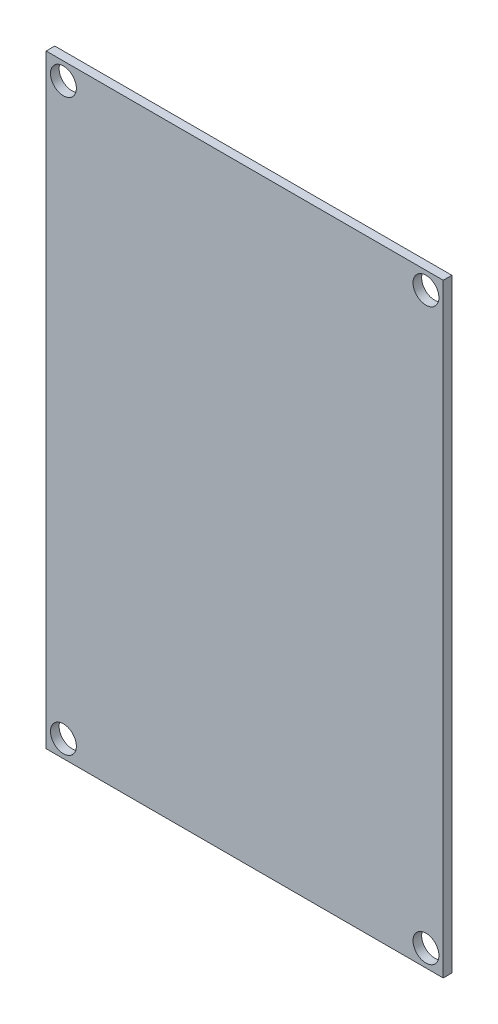
ISO-10303-21;
HEADER;
FILE_DESCRIPTION(('STEP AP214'),'2;1');
FILE_NAME('part.step','',(''),(''),'','','');
FILE_SCHEMA(('AUTOMOTIVE_DESIGN { 1 0 10303 214 1 1 1 1 }'));
ENDSEC;
DATA;
#1=APPLICATION_CONTEXT('core data for automotive mechanical design processes');
#2=APPLICATION_PROTOCOL_DEFINITION('international standard','automotive_design',2000,#1);
#3=PRODUCT_CONTEXT('',#1,'mechanical');
#4=PRODUCT('Part','Part','',(#3));
#5=PRODUCT_RELATED_PRODUCT_CATEGORY('part','',(#4));
#6=PRODUCT_DEFINITION_FORMATION('','',#4);
#7=PRODUCT_DEFINITION_CONTEXT('part definition',#1,'design');
#8=PRODUCT_DEFINITION('design','',#6,#7);
#9=PRODUCT_DEFINITION_SHAPE('','',#8);
#10=(LENGTH_UNIT() NAMED_UNIT(*) SI_UNIT(.MILLI.,.METRE.));
#11=(NAMED_UNIT(*) PLANE_ANGLE_UNIT() SI_UNIT($,.RADIAN.));
#12=(NAMED_UNIT(*) SI_UNIT($,.STERADIAN.) SOLID_ANGLE_UNIT());
#13=UNCERTAINTY_MEASURE_WITH_UNIT(LENGTH_MEASURE(1.E-05),#10,'distance_accuracy_value','');
#14=(GEOMETRIC_REPRESENTATION_CONTEXT(3) GLOBAL_UNCERTAINTY_ASSIGNED_CONTEXT((#13)) GLOBAL_UNIT_ASSIGNED_CONTEXT((#10,
#11,#12)) REPRESENTATION_CONTEXT('',''));
#15=CARTESIAN_POINT('',(0.,0.,0.));
#16=DIRECTION('',(0.,0.,1.));
#17=DIRECTION('',(1.,0.,0.));
#18=AXIS2_PLACEMENT_3D('',#15,#16,#17);
#19=CARTESIAN_POINT('',(23.,-35.,1.));
#20=DIRECTION('',(-1.,0.,0.));
#21=DIRECTION('',(0.,0.,1.));
#22=AXIS2_PLACEMENT_3D('',#19,#20,#21);
#23=PLANE('',#22);
#24=DIRECTION('',(0.,1.,0.));
#25=VECTOR('',#24,1.);
#26=CARTESIAN_POINT('',(23.,-35.,0.));
#27=LINE('',#26,#25);
#28=CARTESIAN_POINT('',(23.,-35.,0.));
#29=VERTEX_POINT('',#28);
#30=CARTESIAN_POINT('',(23.,35.,0.));
#31=VERTEX_POINT('',#30);
#32=EDGE_CURVE('E113',#29,#31,#27,.T.);
#33=ORIENTED_EDGE('',*,*,#32,.T.);
#34=DIRECTION('',(0.,0.,-1.));
#35=VECTOR('',#34,1.);
#36=CARTESIAN_POINT('',(23.,35.,1.));
#37=LINE('',#36,#35);
#38=CARTESIAN_POINT('',(23.,35.,1.));
#39=VERTEX_POINT('',#38);
#40=EDGE_CURVE('E11',#39,#31,#37,.T.);
#41=ORIENTED_EDGE('',*,*,#40,.F.);
#42=DIRECTION('',(0.,1.,0.));
#43=VECTOR('',#42,1.);
#44=CARTESIAN_POINT('',(23.,-35.,1.));
#45=LINE('',#44,#43);
#46=CARTESIAN_POINT('',(23.,-35.,1.));
#47=VERTEX_POINT('',#46);
#48=EDGE_CURVE('E97',#47,#39,#45,.T.);
#49=ORIENTED_EDGE('',*,*,#48,.F.);
#50=DIRECTION('',(0.,0.,-1.));
#51=VECTOR('',#50,1.);
#52=CARTESIAN_POINT('',(23.,-35.,1.));
#53=LINE('',#52,#51);
#54=EDGE_CURVE('E109',#47,#29,#53,.T.);
#55=ORIENTED_EDGE('',*,*,#54,.T.);
#56=EDGE_LOOP('',(#33,#41,#49,#55));
#57=FACE_BOUND('',#56,.T.);
#58=ADVANCED_FACE('F45',(#57),#23,.F.);
#59=CARTESIAN_POINT('',(-23.,35.,1.));
#60=DIRECTION('',(0.,-1.,0.));
#61=DIRECTION('',(0.,0.,-1.));
#62=AXIS2_PLACEMENT_3D('',#59,#60,#61);
#63=PLANE('',#62);
#64=DIRECTION('',(-1.,0.,0.));
#65=VECTOR('',#64,1.);
#66=CARTESIAN_POINT('',(-23.,35.,0.));
#67=LINE('',#66,#65);
#68=CARTESIAN_POINT('',(-23.,35.,0.));
#69=VERTEX_POINT('',#68);
#70=EDGE_CURVE('E102',#31,#69,#67,.T.);
#71=ORIENTED_EDGE('',*,*,#70,.T.);
#72=DIRECTION('',(0.,0.,-1.));
#73=VECTOR('',#72,1.);
#74=CARTESIAN_POINT('',(-23.,35.,1.));
#75=LINE('',#74,#73);
#76=CARTESIAN_POINT('',(-23.,35.,1.));
#77=VERTEX_POINT('',#76);
#78=EDGE_CURVE('E54',#77,#69,#75,.T.);
#79=ORIENTED_EDGE('',*,*,#78,.F.);
#80=DIRECTION('',(-1.,0.,0.));
#81=VECTOR('',#80,1.);
#82=CARTESIAN_POINT('',(-23.,35.,1.));
#83=LINE('',#82,#81);
#84=EDGE_CURVE('E92',#39,#77,#83,.T.);
#85=ORIENTED_EDGE('',*,*,#84,.F.);
#86=ORIENTED_EDGE('',*,*,#40,.T.);
#87=EDGE_LOOP('',(#71,#79,#85,#86));
#88=FACE_BOUND('',#87,.T.);
#89=ADVANCED_FACE('F101',(#88),#63,.F.);
#90=CARTESIAN_POINT('',(-23.,-35.,1.));
#91=DIRECTION('',(1.,0.,0.));
#92=DIRECTION('',(0.,0.,-1.));
#93=AXIS2_PLACEMENT_3D('',#90,#91,#92);
#94=PLANE('',#93);
#95=DIRECTION('',(0.,-1.,0.));
#96=VECTOR('',#95,1.);
#97=CARTESIAN_POINT('',(-23.,-35.,0.));
#98=LINE('',#97,#96);
#99=CARTESIAN_POINT('',(-23.,-35.,0.));
#100=VERTEX_POINT('',#99);
#101=EDGE_CURVE('E79',#69,#100,#98,.T.);
#102=ORIENTED_EDGE('',*,*,#101,.T.);
#103=DIRECTION('',(0.,0.,-1.));
#104=VECTOR('',#103,1.);
#105=CARTESIAN_POINT('',(-23.,-35.,1.));
#106=LINE('',#105,#104);
#107=CARTESIAN_POINT('',(-23.,-35.,1.));
#108=VERTEX_POINT('',#107);
#109=EDGE_CURVE('E104',#108,#100,#106,.T.);
#110=ORIENTED_EDGE('',*,*,#109,.F.);
#111=DIRECTION('',(0.,-1.,0.));
#112=VECTOR('',#111,1.);
#113=CARTESIAN_POINT('',(-23.,-35.,1.));
#114=LINE('',#113,#112);
#115=EDGE_CURVE('E95',#77,#108,#114,.T.);
#116=ORIENTED_EDGE('',*,*,#115,.F.);
#117=ORIENTED_EDGE('',*,*,#78,.T.);
#118=EDGE_LOOP('',(#102,#110,#116,#117));
#119=FACE_BOUND('',#118,.T.);
#120=ADVANCED_FACE('F105',(#119),#94,.F.);
#121=CARTESIAN_POINT('',(-23.,-35.,1.));
#122=DIRECTION('',(0.,1.,0.));
#123=DIRECTION('',(0.,0.,1.));
#124=AXIS2_PLACEMENT_3D('',#121,#122,#123);
#125=PLANE('',#124);
#126=DIRECTION('',(1.,0.,0.));
#127=VECTOR('',#126,1.);
#128=CARTESIAN_POINT('',(-23.,-35.,0.));
#129=LINE('',#128,#127);
#130=EDGE_CURVE('E85',#100,#29,#129,.T.);
#131=ORIENTED_EDGE('',*,*,#130,.T.);
#132=ORIENTED_EDGE('',*,*,#54,.F.);
#133=DIRECTION('',(1.,0.,0.));
#134=VECTOR('',#133,1.);
#135=CARTESIAN_POINT('',(-23.,-35.,1.));
#136=LINE('',#135,#134);
#137=EDGE_CURVE('E62',#108,#47,#136,.T.);
#138=ORIENTED_EDGE('',*,*,#137,.F.);
#139=ORIENTED_EDGE('',*,*,#109,.T.);
#140=EDGE_LOOP('',(#131,#132,#138,#139));
#141=FACE_BOUND('',#140,.T.);
#142=ADVANCED_FACE('F127',(#141),#125,.F.);
#143=CARTESIAN_POINT('',(0.,0.,1.));
#144=DIRECTION('',(0.,0.,-1.));
#145=DIRECTION('',(-1.,0.,0.));
#146=AXIS2_PLACEMENT_3D('',#143,#144,#145);
#147=PLANE('',#146);
#148=CARTESIAN_POINT('',(21.,-33.,1.));
#149=DIRECTION('',(0.,0.,1.));
#150=DIRECTION('',(1.,0.,0.));
#151=AXIS2_PLACEMENT_3D('',#148,#149,#150);
#152=CIRCLE('',#151,1.5);
#153=CARTESIAN_POINT('',(22.5,-33.,1.));
#154=VERTEX_POINT('',#153);
#155=EDGE_CURVE('E138',#154,#154,#152,.T.);
#156=ORIENTED_EDGE('',*,*,#155,.F.);
#157=EDGE_LOOP('',(#156));
#158=FACE_BOUND('',#157,.T.);
#159=CARTESIAN_POINT('',(-21.,33.,1.));
#160=DIRECTION('',(0.,0.,1.));
#161=DIRECTION('',(1.,0.,0.));
#162=AXIS2_PLACEMENT_3D('',#159,#160,#161);
#163=CIRCLE('',#162,1.5);
#164=CARTESIAN_POINT('',(-19.5,33.,1.));
#165=VERTEX_POINT('',#164);
#166=EDGE_CURVE('E146',#165,#165,#163,.T.);
#167=ORIENTED_EDGE('',*,*,#166,.F.);
#168=EDGE_LOOP('',(#167));
#169=FACE_BOUND('',#168,.T.);
#170=CARTESIAN_POINT('',(21.,33.,1.));
#171=DIRECTION('',(0.,0.,1.));
#172=DIRECTION('',(1.,0.,0.));
#173=AXIS2_PLACEMENT_3D('',#170,#171,#172);
#174=CIRCLE('',#173,1.5);
#175=CARTESIAN_POINT('',(22.5,33.,1.));
#176=VERTEX_POINT('',#175);
#177=EDGE_CURVE('E147',#176,#176,#174,.T.);
#178=ORIENTED_EDGE('',*,*,#177,.F.);
#179=EDGE_LOOP('',(#178));
#180=FACE_BOUND('',#179,.T.);
#181=CARTESIAN_POINT('',(-21.,-33.,1.));
#182=DIRECTION('',(0.,0.,1.));
#183=DIRECTION('',(1.,0.,0.));
#184=AXIS2_PLACEMENT_3D('',#181,#182,#183);
#185=CIRCLE('',#184,1.5);
#186=CARTESIAN_POINT('',(-19.5,-33.,1.));
#187=VERTEX_POINT('',#186);
#188=EDGE_CURVE('E134',#187,#187,#185,.T.);
#189=ORIENTED_EDGE('',*,*,#188,.F.);
#190=EDGE_LOOP('',(#189));
#191=FACE_BOUND('',#190,.T.);
#192=ORIENTED_EDGE('',*,*,#48,.T.);
#193=ORIENTED_EDGE('',*,*,#84,.T.);
#194=ORIENTED_EDGE('',*,*,#115,.T.);
#195=ORIENTED_EDGE('',*,*,#137,.T.);
#196=EDGE_LOOP('',(#192,#193,#194,#195));
#197=FACE_BOUND('',#196,.T.);
#198=ADVANCED_FACE('F93',(#158,#169,#180,#191,#197),#147,.F.);
#199=CARTESIAN_POINT('',(0.,0.,0.));
#200=DIRECTION('',(0.,0.,-1.));
#201=DIRECTION('',(-1.,0.,0.));
#202=AXIS2_PLACEMENT_3D('',#199,#200,#201);
#203=PLANE('',#202);
#204=CARTESIAN_POINT('',(21.,-33.,0.));
#205=DIRECTION('',(0.,0.,1.));
#206=DIRECTION('',(1.,0.,0.));
#207=AXIS2_PLACEMENT_3D('',#204,#205,#206);
#208=CIRCLE('',#207,1.5);
#209=CARTESIAN_POINT('',(22.5,-33.,0.));
#210=VERTEX_POINT('',#209);
#211=EDGE_CURVE('E151',#210,#210,#208,.T.);
#212=ORIENTED_EDGE('',*,*,#211,.T.);
#213=EDGE_LOOP('',(#212));
#214=FACE_BOUND('',#213,.T.);
#215=CARTESIAN_POINT('',(-21.,33.,0.));
#216=DIRECTION('',(0.,0.,1.));
#217=DIRECTION('',(1.,0.,0.));
#218=AXIS2_PLACEMENT_3D('',#215,#216,#217);
#219=CIRCLE('',#218,1.5);
#220=CARTESIAN_POINT('',(-19.5,33.,0.));
#221=VERTEX_POINT('',#220);
#222=EDGE_CURVE('E142',#221,#221,#219,.T.);
#223=ORIENTED_EDGE('',*,*,#222,.T.);
#224=EDGE_LOOP('',(#223));
#225=FACE_BOUND('',#224,.T.);
#226=CARTESIAN_POINT('',(21.,33.,0.));
#227=DIRECTION('',(0.,0.,1.));
#228=DIRECTION('',(1.,0.,0.));
#229=AXIS2_PLACEMENT_3D('',#226,#227,#228);
#230=CIRCLE('',#229,1.5);
#231=CARTESIAN_POINT('',(22.5,33.,0.));
#232=VERTEX_POINT('',#231);
#233=EDGE_CURVE('E158',#232,#232,#230,.T.);
#234=ORIENTED_EDGE('',*,*,#233,.T.);
#235=EDGE_LOOP('',(#234));
#236=FACE_BOUND('',#235,.T.);
#237=CARTESIAN_POINT('',(-21.,-33.,0.));
#238=DIRECTION('',(0.,0.,1.));
#239=DIRECTION('',(1.,0.,0.));
#240=AXIS2_PLACEMENT_3D('',#237,#238,#239);
#241=CIRCLE('',#240,1.5);
#242=CARTESIAN_POINT('',(-19.5,-33.,0.));
#243=VERTEX_POINT('',#242);
#244=EDGE_CURVE('E117',#243,#243,#241,.T.);
#245=ORIENTED_EDGE('',*,*,#244,.T.);
#246=EDGE_LOOP('',(#245));
#247=FACE_BOUND('',#246,.T.);
#248=ORIENTED_EDGE('',*,*,#32,.F.);
#249=ORIENTED_EDGE('',*,*,#130,.F.);
#250=ORIENTED_EDGE('',*,*,#101,.F.);
#251=ORIENTED_EDGE('',*,*,#70,.F.);
#252=EDGE_LOOP('',(#248,#249,#250,#251));
#253=FACE_BOUND('',#252,.T.);
#254=ADVANCED_FACE('F130',(#214,#225,#236,#247,#253),#203,.T.);
#255=CARTESIAN_POINT('',(-21.,-33.,0.));
#256=DIRECTION('',(0.,0.,1.));
#257=DIRECTION('',(1.,0.,0.));
#258=AXIS2_PLACEMENT_3D('',#255,#256,#257);
#259=CYLINDRICAL_SURFACE('',#258,1.5);
#260=ORIENTED_EDGE('',*,*,#244,.F.);
#261=EDGE_LOOP('',(#260));
#262=FACE_BOUND('',#261,.T.);
#263=ORIENTED_EDGE('',*,*,#188,.T.);
#264=EDGE_LOOP('',(#263));
#265=FACE_BOUND('',#264,.T.);
#266=ADVANCED_FACE('F174',(#262,#265),#259,.F.);
#267=CARTESIAN_POINT('',(21.,33.,0.));
#268=DIRECTION('',(0.,0.,1.));
#269=DIRECTION('',(1.,0.,0.));
#270=AXIS2_PLACEMENT_3D('',#267,#268,#269);
#271=CYLINDRICAL_SURFACE('',#270,1.5);
#272=ORIENTED_EDGE('',*,*,#233,.F.);
#273=EDGE_LOOP('',(#272));
#274=FACE_BOUND('',#273,.T.);
#275=ORIENTED_EDGE('',*,*,#177,.T.);
#276=EDGE_LOOP('',(#275));
#277=FACE_BOUND('',#276,.T.);
#278=ADVANCED_FACE('F166',(#274,#277),#271,.F.);
#279=CARTESIAN_POINT('',(-21.,33.,0.));
#280=DIRECTION('',(0.,0.,1.));
#281=DIRECTION('',(1.,0.,0.));
#282=AXIS2_PLACEMENT_3D('',#279,#280,#281);
#283=CYLINDRICAL_SURFACE('',#282,1.5);
#284=ORIENTED_EDGE('',*,*,#222,.F.);
#285=EDGE_LOOP('',(#284));
#286=FACE_BOUND('',#285,.T.);
#287=ORIENTED_EDGE('',*,*,#166,.T.);
#288=EDGE_LOOP('',(#287));
#289=FACE_BOUND('',#288,.T.);
#290=ADVANCED_FACE('F182',(#286,#289),#283,.F.);
#291=CARTESIAN_POINT('',(21.,-33.,0.));
#292=DIRECTION('',(0.,0.,1.));
#293=DIRECTION('',(1.,0.,0.));
#294=AXIS2_PLACEMENT_3D('',#291,#292,#293);
#295=CYLINDRICAL_SURFACE('',#294,1.5);
#296=ORIENTED_EDGE('',*,*,#211,.F.);
#297=EDGE_LOOP('',(#296));
#298=FACE_BOUND('',#297,.T.);
#299=ORIENTED_EDGE('',*,*,#155,.T.);
#300=EDGE_LOOP('',(#299));
#301=FACE_BOUND('',#300,.T.);
#302=ADVANCED_FACE('F233',(#298,#301),#295,.F.);
#303=CLOSED_SHELL('',(#58,#89,#120,#142,#198,#254,#266,#278,#290,#302));
#304=MANIFOLD_SOLID_BREP('B2',#303);
#305=ADVANCED_BREP_SHAPE_REPRESENTATION('',(#18,#304),#14);
#306=SHAPE_DEFINITION_REPRESENTATION(#9,#305);
ENDSEC;
END-ISO-10303-21;
